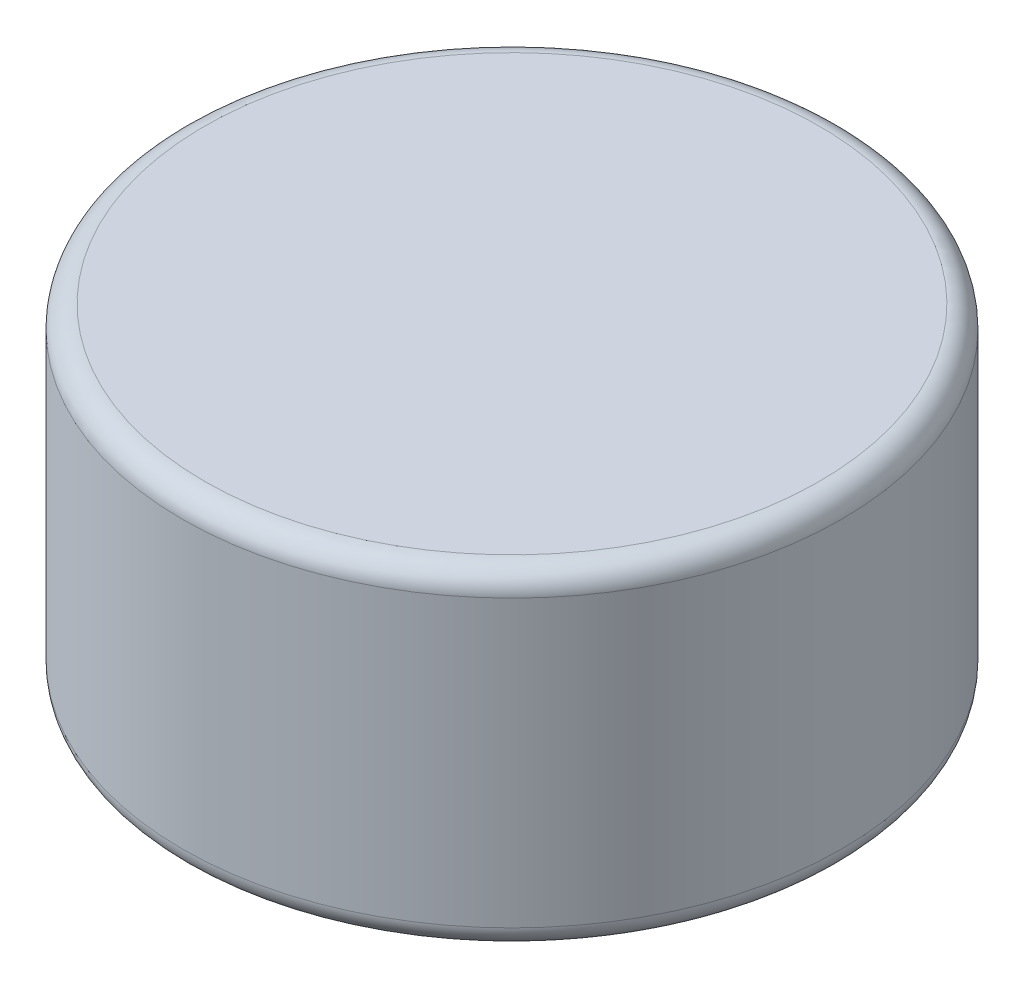
ISO-10303-21;
HEADER;
FILE_DESCRIPTION(('STEP AP214'),'2;1');
FILE_NAME('part.step','',(''),(''),'','','');
FILE_SCHEMA(('AUTOMOTIVE_DESIGN { 1 0 10303 214 1 1 1 1 }'));
ENDSEC;
DATA;
#1=APPLICATION_CONTEXT('core data for automotive mechanical design processes');
#2=APPLICATION_PROTOCOL_DEFINITION('international standard','automotive_design',2000,#1);
#3=PRODUCT_CONTEXT('',#1,'mechanical');
#4=PRODUCT('Part','Part','',(#3));
#5=PRODUCT_RELATED_PRODUCT_CATEGORY('part','',(#4));
#6=PRODUCT_DEFINITION_FORMATION('','',#4);
#7=PRODUCT_DEFINITION_CONTEXT('part definition',#1,'design');
#8=PRODUCT_DEFINITION('design','',#6,#7);
#9=PRODUCT_DEFINITION_SHAPE('','',#8);
#10=(LENGTH_UNIT() NAMED_UNIT(*) SI_UNIT(.MILLI.,.METRE.));
#11=(NAMED_UNIT(*) PLANE_ANGLE_UNIT() SI_UNIT($,.RADIAN.));
#12=(NAMED_UNIT(*) SI_UNIT($,.STERADIAN.) SOLID_ANGLE_UNIT());
#13=UNCERTAINTY_MEASURE_WITH_UNIT(LENGTH_MEASURE(1.E-05),#10,'distance_accuracy_value','');
#14=(GEOMETRIC_REPRESENTATION_CONTEXT(3) GLOBAL_UNCERTAINTY_ASSIGNED_CONTEXT((#13)) GLOBAL_UNIT_ASSIGNED_CONTEXT((#10,
#11,#12)) REPRESENTATION_CONTEXT('',''));
#15=CARTESIAN_POINT('',(0.,0.,0.));
#16=DIRECTION('',(0.,0.,1.));
#17=DIRECTION('',(1.,0.,0.));
#18=AXIS2_PLACEMENT_3D('',#15,#16,#17);
#19=CARTESIAN_POINT('',(0.,3.,0.));
#20=DIRECTION('',(0.,-1.,0.));
#21=DIRECTION('',(0.,0.,-1.));
#22=AXIS2_PLACEMENT_3D('',#19,#20,#21);
#23=CYLINDRICAL_SURFACE('',#22,3.);
#24=CARTESIAN_POINT('',(0.,0.2,0.));
#25=DIRECTION('',(0.,1.,0.));
#26=DIRECTION('',(0.,0.,1.));
#27=AXIS2_PLACEMENT_3D('',#24,#25,#26);
#28=CIRCLE('',#27,3.);
#29=CARTESIAN_POINT('',(0.,0.2,3.));
#30=VERTEX_POINT('',#29);
#31=EDGE_CURVE('E44',#30,#30,#28,.T.);
#32=ORIENTED_EDGE('',*,*,#31,.T.);
#33=EDGE_LOOP('',(#32));
#34=FACE_BOUND('',#33,.T.);
#35=CARTESIAN_POINT('',(0.,2.8,0.));
#36=DIRECTION('',(0.,1.,0.));
#37=DIRECTION('',(0.,0.,1.));
#38=AXIS2_PLACEMENT_3D('',#35,#36,#37);
#39=CIRCLE('',#38,3.);
#40=CARTESIAN_POINT('',(0.,2.8,3.));
#41=VERTEX_POINT('',#40);
#42=EDGE_CURVE('E48',#41,#41,#39,.F.);
#43=ORIENTED_EDGE('',*,*,#42,.T.);
#44=EDGE_LOOP('',(#43));
#45=FACE_BOUND('',#44,.T.);
#46=ADVANCED_FACE('F33',(#34,#45),#23,.T.);
#47=CARTESIAN_POINT('',(0.,3.,0.));
#48=DIRECTION('',(0.,1.,0.));
#49=DIRECTION('',(0.,0.,1.));
#50=AXIS2_PLACEMENT_3D('',#47,#48,#49);
#51=PLANE('',#50);
#52=CARTESIAN_POINT('',(0.,3.,0.));
#53=DIRECTION('',(0.,1.,0.));
#54=DIRECTION('',(0.,0.,1.));
#55=AXIS2_PLACEMENT_3D('',#52,#53,#54);
#56=CIRCLE('',#55,2.8);
#57=CARTESIAN_POINT('',(0.,3.,2.8));
#58=VERTEX_POINT('',#57);
#59=EDGE_CURVE('E10',#58,#58,#56,.T.);
#60=ORIENTED_EDGE('',*,*,#59,.T.);
#61=EDGE_LOOP('',(#60));
#62=FACE_BOUND('',#61,.T.);
#63=ADVANCED_FACE('F64',(#62),#51,.T.);
#64=CARTESIAN_POINT('',(0.,0.,0.));
#65=DIRECTION('',(0.,1.,0.));
#66=DIRECTION('',(0.,0.,1.));
#67=AXIS2_PLACEMENT_3D('',#64,#65,#66);
#68=PLANE('',#67);
#69=CARTESIAN_POINT('',(0.,0.,0.));
#70=DIRECTION('',(0.,1.,0.));
#71=DIRECTION('',(0.,0.,1.));
#72=AXIS2_PLACEMENT_3D('',#69,#70,#71);
#73=CIRCLE('',#72,2.8);
#74=CARTESIAN_POINT('',(0.,0.,2.8));
#75=VERTEX_POINT('',#74);
#76=EDGE_CURVE('E40',#75,#75,#73,.F.);
#77=ORIENTED_EDGE('',*,*,#76,.T.);
#78=EDGE_LOOP('',(#77));
#79=FACE_BOUND('',#78,.T.);
#80=ADVANCED_FACE('F61',(#79),#68,.F.);
#81=CARTESIAN_POINT('',(0.,0.2,0.));
#82=DIRECTION('',(0.,1.,0.));
#83=DIRECTION('',(0.,0.,1.));
#84=AXIS2_PLACEMENT_3D('',#81,#82,#83);
#85=TOROIDAL_SURFACE('',#84,2.8,0.2);
#86=ORIENTED_EDGE('',*,*,#76,.F.);
#87=EDGE_LOOP('',(#86));
#88=FACE_BOUND('',#87,.T.);
#89=ORIENTED_EDGE('',*,*,#31,.F.);
#90=EDGE_LOOP('',(#89));
#91=FACE_BOUND('',#90,.T.);
#92=ADVANCED_FACE('F57',(#88,#91),#85,.T.);
#93=CARTESIAN_POINT('',(0.,2.8,0.));
#94=DIRECTION('',(0.,1.,0.));
#95=DIRECTION('',(0.,0.,1.));
#96=AXIS2_PLACEMENT_3D('',#93,#94,#95);
#97=TOROIDAL_SURFACE('',#96,2.8,0.2);
#98=ORIENTED_EDGE('',*,*,#42,.F.);
#99=EDGE_LOOP('',(#98));
#100=FACE_BOUND('',#99,.T.);
#101=ORIENTED_EDGE('',*,*,#59,.F.);
#102=EDGE_LOOP('',(#101));
#103=FACE_BOUND('',#102,.T.);
#104=ADVANCED_FACE('F35',(#100,#103),#97,.T.);
#105=CLOSED_SHELL('',(#46,#63,#80,#92,#104));
#106=MANIFOLD_SOLID_BREP('B2',#105);
#107=ADVANCED_BREP_SHAPE_REPRESENTATION('',(#18,#106),#14);
#108=SHAPE_DEFINITION_REPRESENTATION(#9,#107);
ENDSEC;
END-ISO-10303-21;
